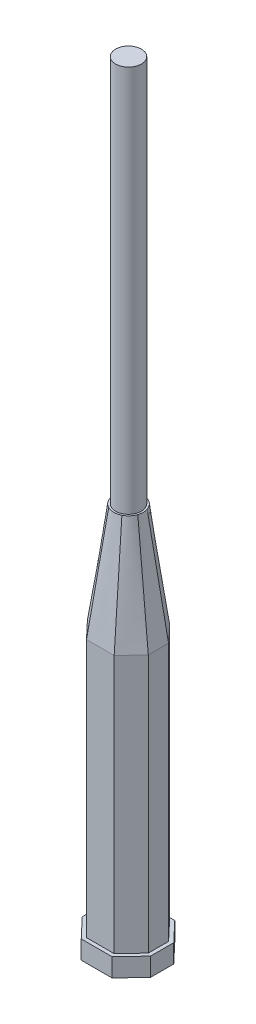
ISO-10303-21;
HEADER;
FILE_DESCRIPTION(('STEP AP214'),'2;1');
FILE_NAME('part.step','',(''),(''),'','','');
FILE_SCHEMA(('AUTOMOTIVE_DESIGN { 1 0 10303 214 1 1 1 1 }'));
ENDSEC;
DATA;
#1=APPLICATION_CONTEXT('core data for automotive mechanical design processes');
#2=APPLICATION_PROTOCOL_DEFINITION('international standard','automotive_design',2000,#1);
#3=PRODUCT_CONTEXT('',#1,'mechanical');
#4=PRODUCT('Part','Part','',(#3));
#5=PRODUCT_RELATED_PRODUCT_CATEGORY('part','',(#4));
#6=PRODUCT_DEFINITION_FORMATION('','',#4);
#7=PRODUCT_DEFINITION_CONTEXT('part definition',#1,'design');
#8=PRODUCT_DEFINITION('design','',#6,#7);
#9=PRODUCT_DEFINITION_SHAPE('','',#8);
#10=(LENGTH_UNIT() NAMED_UNIT(*) SI_UNIT(.MILLI.,.METRE.));
#11=(NAMED_UNIT(*) PLANE_ANGLE_UNIT() SI_UNIT($,.RADIAN.));
#12=(NAMED_UNIT(*) SI_UNIT($,.STERADIAN.) SOLID_ANGLE_UNIT());
#13=UNCERTAINTY_MEASURE_WITH_UNIT(LENGTH_MEASURE(1.E-05),#10,'distance_accuracy_value','');
#14=(GEOMETRIC_REPRESENTATION_CONTEXT(3) GLOBAL_UNCERTAINTY_ASSIGNED_CONTEXT((#13)) GLOBAL_UNIT_ASSIGNED_CONTEXT((#10,
#11,#12)) REPRESENTATION_CONTEXT('',''));
#15=CARTESIAN_POINT('',(0.,0.,0.));
#16=DIRECTION('',(0.,0.,1.));
#17=DIRECTION('',(1.,0.,0.));
#18=AXIS2_PLACEMENT_3D('',#15,#16,#17);
#19=CARTESIAN_POINT('',(-18.5,-10.,-6.29694496184497));
#20=DIRECTION('',(-1.,0.,0.));
#21=DIRECTION('',(0.,0.,1.));
#22=AXIS2_PLACEMENT_3D('',#19,#20,#21);
#23=PLANE('',#22);
#24=DIRECTION('',(0.,0.,1.));
#25=VECTOR('',#24,1.);
#26=CARTESIAN_POINT('',(-18.5,0.,-6.29694496184497));
#27=LINE('',#26,#25);
#28=CARTESIAN_POINT('',(-18.5,0.,-6.29694496184497));
#29=VERTEX_POINT('',#28);
#30=CARTESIAN_POINT('',(-18.5,0.,6.29694496184498));
#31=VERTEX_POINT('',#30);
#32=EDGE_CURVE('E497',#29,#31,#27,.T.);
#33=ORIENTED_EDGE('',*,*,#32,.F.);
#34=DIRECTION('',(0.,1.,0.));
#35=VECTOR('',#34,1.);
#36=CARTESIAN_POINT('',(-18.5,-10.,-6.29694496184497));
#37=LINE('',#36,#35);
#38=CARTESIAN_POINT('',(-18.5,-10.,-6.29694496184497));
#39=VERTEX_POINT('',#38);
#40=EDGE_CURVE('E100',#39,#29,#37,.T.);
#41=ORIENTED_EDGE('',*,*,#40,.F.);
#42=DIRECTION('',(0.,0.,1.));
#43=VECTOR('',#42,1.);
#44=CARTESIAN_POINT('',(-18.5,-10.,-6.29694496184497));
#45=LINE('',#44,#43);
#46=CARTESIAN_POINT('',(-18.5,-10.,6.29694496184498));
#47=VERTEX_POINT('',#46);
#48=EDGE_CURVE('E471',#39,#47,#45,.T.);
#49=ORIENTED_EDGE('',*,*,#48,.T.);
#50=DIRECTION('',(0.,1.,0.));
#51=VECTOR('',#50,1.);
#52=CARTESIAN_POINT('',(-18.5,-10.,6.29694496184498));
#53=LINE('',#52,#51);
#54=EDGE_CURVE('E496',#47,#31,#53,.T.);
#55=ORIENTED_EDGE('',*,*,#54,.T.);
#56=EDGE_LOOP('',(#33,#41,#49,#55));
#57=FACE_BOUND('',#56,.T.);
#58=ADVANCED_FACE('F92',(#57),#23,.T.);
#59=CARTESIAN_POINT('',(-8.36026364806365,-10.,-17.));
#60=DIRECTION('',(-0.725952683905827,0.,-0.687744647910783));
#61=DIRECTION('',(-0.687744647910783,0.,0.725952683905827));
#62=AXIS2_PLACEMENT_3D('',#59,#60,#61);
#63=PLANE('',#62);
#64=DIRECTION('',(-0.687744647910783,0.,0.725952683905827));
#65=VECTOR('',#64,1.);
#66=CARTESIAN_POINT('',(-8.36026364806365,0.,-17.));
#67=LINE('',#66,#65);
#68=CARTESIAN_POINT('',(-8.36026364806365,0.,-17.));
#69=VERTEX_POINT('',#68);
#70=EDGE_CURVE('E475',#69,#29,#67,.T.);
#71=ORIENTED_EDGE('',*,*,#70,.F.);
#72=DIRECTION('',(0.,1.,0.));
#73=VECTOR('',#72,1.);
#74=CARTESIAN_POINT('',(-8.36026364806365,-10.,-17.));
#75=LINE('',#74,#73);
#76=CARTESIAN_POINT('',(-8.36026364806365,-10.,-17.));
#77=VERTEX_POINT('',#76);
#78=EDGE_CURVE('E523',#77,#69,#75,.T.);
#79=ORIENTED_EDGE('',*,*,#78,.F.);
#80=DIRECTION('',(-0.687744647910783,0.,0.725952683905827));
#81=VECTOR('',#80,1.);
#82=CARTESIAN_POINT('',(-8.36026364806365,-10.,-17.));
#83=LINE('',#82,#81);
#84=EDGE_CURVE('E493',#77,#39,#83,.T.);
#85=ORIENTED_EDGE('',*,*,#84,.T.);
#86=ORIENTED_EDGE('',*,*,#40,.T.);
#87=EDGE_LOOP('',(#71,#79,#85,#86));
#88=FACE_BOUND('',#87,.T.);
#89=ADVANCED_FACE('F652',(#88),#63,.T.);
#90=CARTESIAN_POINT('',(8.36026364806367,-10.,-17.));
#91=DIRECTION('',(0.,0.,-1.));
#92=DIRECTION('',(-1.,0.,0.));
#93=AXIS2_PLACEMENT_3D('',#90,#91,#92);
#94=PLANE('',#93);
#95=DIRECTION('',(-1.,0.,0.));
#96=VECTOR('',#95,1.);
#97=CARTESIAN_POINT('',(8.36026364806367,0.,-17.));
#98=LINE('',#97,#96);
#99=CARTESIAN_POINT('',(8.36026364806367,0.,-17.));
#100=VERTEX_POINT('',#99);
#101=EDGE_CURVE('E516',#100,#69,#98,.T.);
#102=ORIENTED_EDGE('',*,*,#101,.F.);
#103=DIRECTION('',(0.,1.,0.));
#104=VECTOR('',#103,1.);
#105=CARTESIAN_POINT('',(8.36026364806367,-10.,-17.));
#106=LINE('',#105,#104);
#107=CARTESIAN_POINT('',(8.36026364806367,-10.,-17.));
#108=VERTEX_POINT('',#107);
#109=EDGE_CURVE('E526',#108,#100,#106,.T.);
#110=ORIENTED_EDGE('',*,*,#109,.F.);
#111=DIRECTION('',(-1.,0.,0.));
#112=VECTOR('',#111,1.);
#113=CARTESIAN_POINT('',(8.36026364806367,-10.,-17.));
#114=LINE('',#113,#112);
#115=EDGE_CURVE('E490',#108,#77,#114,.T.);
#116=ORIENTED_EDGE('',*,*,#115,.T.);
#117=ORIENTED_EDGE('',*,*,#78,.T.);
#118=EDGE_LOOP('',(#102,#110,#116,#117));
#119=FACE_BOUND('',#118,.T.);
#120=ADVANCED_FACE('F660',(#119),#94,.T.);
#121=CARTESIAN_POINT('',(18.5,-10.,-6.29694496184498));
#122=DIRECTION('',(0.725952683905827,0.,-0.687744647910782));
#123=DIRECTION('',(-0.687744647910783,0.,-0.725952683905827));
#124=AXIS2_PLACEMENT_3D('',#121,#122,#123);
#125=PLANE('',#124);
#126=DIRECTION('',(-0.687744647910782,0.,-0.725952683905827));
#127=VECTOR('',#126,1.);
#128=CARTESIAN_POINT('',(18.5,0.,-6.29694496184498));
#129=LINE('',#128,#127);
#130=CARTESIAN_POINT('',(18.5,0.,-6.29694496184498));
#131=VERTEX_POINT('',#130);
#132=EDGE_CURVE('E513',#131,#100,#129,.T.);
#133=ORIENTED_EDGE('',*,*,#132,.F.);
#134=DIRECTION('',(0.,1.,0.));
#135=VECTOR('',#134,1.);
#136=CARTESIAN_POINT('',(18.5,-10.,-6.29694496184498));
#137=LINE('',#136,#135);
#138=CARTESIAN_POINT('',(18.5,-10.,-6.29694496184498));
#139=VERTEX_POINT('',#138);
#140=EDGE_CURVE('E529',#139,#131,#137,.T.);
#141=ORIENTED_EDGE('',*,*,#140,.F.);
#142=DIRECTION('',(-0.687744647910782,0.,-0.725952683905827));
#143=VECTOR('',#142,1.);
#144=CARTESIAN_POINT('',(18.5,-10.,-6.29694496184498));
#145=LINE('',#144,#143);
#146=EDGE_CURVE('E487',#139,#108,#145,.T.);
#147=ORIENTED_EDGE('',*,*,#146,.T.);
#148=ORIENTED_EDGE('',*,*,#109,.T.);
#149=EDGE_LOOP('',(#133,#141,#147,#148));
#150=FACE_BOUND('',#149,.T.);
#151=ADVANCED_FACE('F667',(#150),#125,.T.);
#152=CARTESIAN_POINT('',(18.5,-10.,6.29694496184498));
#153=DIRECTION('',(1.,0.,0.));
#154=DIRECTION('',(0.,0.,-1.));
#155=AXIS2_PLACEMENT_3D('',#152,#153,#154);
#156=PLANE('',#155);
#157=DIRECTION('',(0.,0.,-1.));
#158=VECTOR('',#157,1.);
#159=CARTESIAN_POINT('',(18.5,0.,6.29694496184498));
#160=LINE('',#159,#158);
#161=CARTESIAN_POINT('',(18.5,0.,6.29694496184498));
#162=VERTEX_POINT('',#161);
#163=EDGE_CURVE('E510',#162,#131,#160,.T.);
#164=ORIENTED_EDGE('',*,*,#163,.F.);
#165=DIRECTION('',(0.,1.,0.));
#166=VECTOR('',#165,1.);
#167=CARTESIAN_POINT('',(18.5,-10.,6.29694496184498));
#168=LINE('',#167,#166);
#169=CARTESIAN_POINT('',(18.5,-10.,6.29694496184498));
#170=VERTEX_POINT('',#169);
#171=EDGE_CURVE('E532',#170,#162,#168,.T.);
#172=ORIENTED_EDGE('',*,*,#171,.F.);
#173=DIRECTION('',(0.,0.,-1.));
#174=VECTOR('',#173,1.);
#175=CARTESIAN_POINT('',(18.5,-10.,6.29694496184498));
#176=LINE('',#175,#174);
#177=EDGE_CURVE('E484',#170,#139,#176,.T.);
#178=ORIENTED_EDGE('',*,*,#177,.T.);
#179=ORIENTED_EDGE('',*,*,#140,.T.);
#180=EDGE_LOOP('',(#164,#172,#178,#179));
#181=FACE_BOUND('',#180,.T.);
#182=ADVANCED_FACE('F670',(#181),#156,.T.);
#183=CARTESIAN_POINT('',(8.36026364806367,-10.,17.));
#184=DIRECTION('',(0.725952683905827,0.,0.687744647910783));
#185=DIRECTION('',(0.687744647910783,0.,-0.725952683905827));
#186=AXIS2_PLACEMENT_3D('',#183,#184,#185);
#187=PLANE('',#186);
#188=DIRECTION('',(0.687744647910783,0.,-0.725952683905827));
#189=VECTOR('',#188,1.);
#190=CARTESIAN_POINT('',(8.36026364806367,0.,17.));
#191=LINE('',#190,#189);
#192=CARTESIAN_POINT('',(8.36026364806367,0.,17.));
#193=VERTEX_POINT('',#192);
#194=EDGE_CURVE('E507',#193,#162,#191,.T.);
#195=ORIENTED_EDGE('',*,*,#194,.F.);
#196=DIRECTION('',(0.,1.,0.));
#197=VECTOR('',#196,1.);
#198=CARTESIAN_POINT('',(8.36026364806367,-10.,17.));
#199=LINE('',#198,#197);
#200=CARTESIAN_POINT('',(8.36026364806367,-10.,17.));
#201=VERTEX_POINT('',#200);
#202=EDGE_CURVE('E535',#201,#193,#199,.T.);
#203=ORIENTED_EDGE('',*,*,#202,.F.);
#204=DIRECTION('',(0.687744647910783,0.,-0.725952683905827));
#205=VECTOR('',#204,1.);
#206=CARTESIAN_POINT('',(8.36026364806367,-10.,17.));
#207=LINE('',#206,#205);
#208=EDGE_CURVE('E481',#201,#170,#207,.T.);
#209=ORIENTED_EDGE('',*,*,#208,.T.);
#210=ORIENTED_EDGE('',*,*,#171,.T.);
#211=EDGE_LOOP('',(#195,#203,#209,#210));
#212=FACE_BOUND('',#211,.T.);
#213=ADVANCED_FACE('F675',(#212),#187,.T.);
#214=CARTESIAN_POINT('',(-8.36026364806369,-10.,17.));
#215=DIRECTION('',(0.,0.,1.));
#216=DIRECTION('',(1.,0.,0.));
#217=AXIS2_PLACEMENT_3D('',#214,#215,#216);
#218=PLANE('',#217);
#219=DIRECTION('',(1.,0.,0.));
#220=VECTOR('',#219,1.);
#221=CARTESIAN_POINT('',(-8.36026364806369,0.,17.));
#222=LINE('',#221,#220);
#223=CARTESIAN_POINT('',(-8.36026364806369,0.,17.));
#224=VERTEX_POINT('',#223);
#225=EDGE_CURVE('E504',#224,#193,#222,.T.);
#226=ORIENTED_EDGE('',*,*,#225,.F.);
#227=DIRECTION('',(0.,1.,0.));
#228=VECTOR('',#227,1.);
#229=CARTESIAN_POINT('',(-8.36026364806369,-10.,17.));
#230=LINE('',#229,#228);
#231=CARTESIAN_POINT('',(-8.36026364806369,-10.,17.));
#232=VERTEX_POINT('',#231);
#233=EDGE_CURVE('E538',#232,#224,#230,.T.);
#234=ORIENTED_EDGE('',*,*,#233,.F.);
#235=DIRECTION('',(1.,0.,0.));
#236=VECTOR('',#235,1.);
#237=CARTESIAN_POINT('',(-8.36026364806369,-10.,17.));
#238=LINE('',#237,#236);
#239=EDGE_CURVE('E478',#232,#201,#238,.T.);
#240=ORIENTED_EDGE('',*,*,#239,.T.);
#241=ORIENTED_EDGE('',*,*,#202,.T.);
#242=EDGE_LOOP('',(#226,#234,#240,#241));
#243=FACE_BOUND('',#242,.T.);
#244=ADVANCED_FACE('F678',(#243),#218,.T.);
#245=CARTESIAN_POINT('',(-18.5,-10.,6.29694496184498));
#246=DIRECTION('',(-0.725952683905827,0.,0.687744647910783));
#247=DIRECTION('',(0.687744647910783,0.,0.725952683905827));
#248=AXIS2_PLACEMENT_3D('',#245,#246,#247);
#249=PLANE('',#248);
#250=DIRECTION('',(0.687744647910783,0.,0.725952683905827));
#251=VECTOR('',#250,1.);
#252=CARTESIAN_POINT('',(-18.5,0.,6.29694496184498));
#253=LINE('',#252,#251);
#254=EDGE_CURVE('E500',#31,#224,#253,.T.);
#255=ORIENTED_EDGE('',*,*,#254,.F.);
#256=ORIENTED_EDGE('',*,*,#54,.F.);
#257=DIRECTION('',(0.687744647910783,0.,0.725952683905827));
#258=VECTOR('',#257,1.);
#259=CARTESIAN_POINT('',(-18.5,-10.,6.29694496184498));
#260=LINE('',#259,#258);
#261=EDGE_CURVE('E474',#47,#232,#260,.T.);
#262=ORIENTED_EDGE('',*,*,#261,.T.);
#263=ORIENTED_EDGE('',*,*,#233,.T.);
#264=EDGE_LOOP('',(#255,#256,#262,#263));
#265=FACE_BOUND('',#264,.T.);
#266=ADVANCED_FACE('F681',(#265),#249,.T.);
#267=CARTESIAN_POINT('',(0.,-10.,0.));
#268=DIRECTION('',(0.,1.,0.));
#269=DIRECTION('',(0.,0.,1.));
#270=AXIS2_PLACEMENT_3D('',#267,#268,#269);
#271=PLANE('',#270);
#272=ORIENTED_EDGE('',*,*,#48,.F.);
#273=ORIENTED_EDGE('',*,*,#84,.F.);
#274=ORIENTED_EDGE('',*,*,#115,.F.);
#275=ORIENTED_EDGE('',*,*,#146,.F.);
#276=ORIENTED_EDGE('',*,*,#177,.F.);
#277=ORIENTED_EDGE('',*,*,#208,.F.);
#278=ORIENTED_EDGE('',*,*,#239,.F.);
#279=ORIENTED_EDGE('',*,*,#261,.F.);
#280=EDGE_LOOP('',(#272,#273,#274,#275,#276,#277,#278,#279));
#281=FACE_BOUND('',#280,.T.);
#282=ADVANCED_FACE('F665',(#281),#271,.F.);
#283=CARTESIAN_POINT('',(0.,0.,0.));
#284=DIRECTION('',(0.,1.,0.));
#285=DIRECTION('',(0.,0.,1.));
#286=AXIS2_PLACEMENT_3D('',#283,#284,#285);
#287=PLANE('',#286);
#288=DIRECTION('',(0.,0.,1.));
#289=VECTOR('',#288,1.);
#290=CARTESIAN_POINT('',(16.5,0.,0.));
#291=LINE('',#290,#289);
#292=CARTESIAN_POINT('',(16.5,0.,-5.5));
#293=VERTEX_POINT('',#292);
#294=CARTESIAN_POINT('',(16.5,0.,5.5));
#295=VERTEX_POINT('',#294);
#296=EDGE_CURVE('E446',#293,#295,#291,.T.);
#297=ORIENTED_EDGE('',*,*,#296,.T.);
#298=DIRECTION('',(0.687744647910783,0.,-0.725952683905827));
#299=VECTOR('',#298,1.);
#300=CARTESIAN_POINT('',(11.4416058394161,0.,10.8394160583942));
#301=LINE('',#300,#299);
#302=CARTESIAN_POINT('',(7.50000000000001,0.,15.));
#303=VERTEX_POINT('',#302);
#304=EDGE_CURVE('E467',#303,#295,#301,.T.);
#305=ORIENTED_EDGE('',*,*,#304,.F.);
#306=DIRECTION('',(-1.,0.,0.));
#307=VECTOR('',#306,1.);
#308=CARTESIAN_POINT('',(0.,0.,15.));
#309=LINE('',#308,#307);
#310=CARTESIAN_POINT('',(-7.50000000000002,0.,15.));
#311=VERTEX_POINT('',#310);
#312=EDGE_CURVE('E108',#303,#311,#309,.T.);
#313=ORIENTED_EDGE('',*,*,#312,.T.);
#314=DIRECTION('',(0.687744647910783,0.,0.725952683905827));
#315=VECTOR('',#314,1.);
#316=CARTESIAN_POINT('',(-11.4416058394161,0.,10.8394160583942));
#317=LINE('',#316,#315);
#318=CARTESIAN_POINT('',(-16.5,0.,5.5));
#319=VERTEX_POINT('',#318);
#320=EDGE_CURVE('E463',#319,#311,#317,.T.);
#321=ORIENTED_EDGE('',*,*,#320,.F.);
#322=DIRECTION('',(0.,0.,-1.));
#323=VECTOR('',#322,1.);
#324=CARTESIAN_POINT('',(-16.5,0.,0.));
#325=LINE('',#324,#323);
#326=CARTESIAN_POINT('',(-16.5,0.,-5.5));
#327=VERTEX_POINT('',#326);
#328=EDGE_CURVE('E460',#319,#327,#325,.T.);
#329=ORIENTED_EDGE('',*,*,#328,.T.);
#330=DIRECTION('',(-0.687744647910783,0.,0.725952683905827));
#331=VECTOR('',#330,1.);
#332=CARTESIAN_POINT('',(-11.4416058394161,0.,-10.8394160583942));
#333=LINE('',#332,#331);
#334=CARTESIAN_POINT('',(-7.5,0.,-15.));
#335=VERTEX_POINT('',#334);
#336=EDGE_CURVE('E458',#335,#327,#333,.T.);
#337=ORIENTED_EDGE('',*,*,#336,.F.);
#338=DIRECTION('',(1.,0.,0.));
#339=VECTOR('',#338,1.);
#340=CARTESIAN_POINT('',(0.,0.,-15.));
#341=LINE('',#340,#339);
#342=CARTESIAN_POINT('',(7.50000000000001,0.,-15.));
#343=VERTEX_POINT('',#342);
#344=EDGE_CURVE('E150',#335,#343,#341,.T.);
#345=ORIENTED_EDGE('',*,*,#344,.T.);
#346=DIRECTION('',(-0.687744647910783,0.,-0.725952683905827));
#347=VECTOR('',#346,1.);
#348=CARTESIAN_POINT('',(11.4416058394161,0.,-10.8394160583942));
#349=LINE('',#348,#347);
#350=EDGE_CURVE('E454',#293,#343,#349,.T.);
#351=ORIENTED_EDGE('',*,*,#350,.F.);
#352=EDGE_LOOP('',(#297,#305,#313,#321,#329,#337,#345,#351));
#353=FACE_BOUND('',#352,.T.);
#354=ORIENTED_EDGE('',*,*,#32,.T.);
#355=ORIENTED_EDGE('',*,*,#254,.T.);
#356=ORIENTED_EDGE('',*,*,#225,.T.);
#357=ORIENTED_EDGE('',*,*,#194,.T.);
#358=ORIENTED_EDGE('',*,*,#163,.T.);
#359=ORIENTED_EDGE('',*,*,#132,.T.);
#360=ORIENTED_EDGE('',*,*,#101,.T.);
#361=ORIENTED_EDGE('',*,*,#70,.T.);
#362=EDGE_LOOP('',(#354,#355,#356,#357,#358,#359,#360,#361));
#363=FACE_BOUND('',#362,.T.);
#364=ADVANCED_FACE('F658',(#353,#363),#287,.T.);
#365=CARTESIAN_POINT('',(16.5,140.,0.));
#366=DIRECTION('',(1.,0.,0.));
#367=DIRECTION('',(0.,0.,-1.));
#368=AXIS2_PLACEMENT_3D('',#365,#366,#367);
#369=PLANE('',#368);
#370=ORIENTED_EDGE('',*,*,#296,.F.);
#371=DIRECTION('',(0.,-1.,0.));
#372=VECTOR('',#371,1.);
#373=CARTESIAN_POINT('',(16.5,140.,-5.5));
#374=LINE('',#373,#372);
#375=CARTESIAN_POINT('',(16.5,140.,-5.49999999999999));
#376=VERTEX_POINT('',#375);
#377=EDGE_CURVE('E501',#376,#293,#374,.T.);
#378=ORIENTED_EDGE('',*,*,#377,.F.);
#379=DIRECTION('',(0.,0.,-1.));
#380=VECTOR('',#379,1.);
#381=CARTESIAN_POINT('',(16.5,140.,0.));
#382=LINE('',#381,#380);
#383=CARTESIAN_POINT('',(16.5,140.,5.5));
#384=VERTEX_POINT('',#383);
#385=EDGE_CURVE('E470',#376,#384,#382,.F.);
#386=ORIENTED_EDGE('',*,*,#385,.T.);
#387=DIRECTION('',(0.,-1.,0.));
#388=VECTOR('',#387,1.);
#389=CARTESIAN_POINT('',(16.5,140.,5.5));
#390=LINE('',#389,#388);
#391=EDGE_CURVE('E548',#384,#295,#390,.T.);
#392=ORIENTED_EDGE('',*,*,#391,.T.);
#393=EDGE_LOOP('',(#370,#378,#386,#392));
#394=FACE_BOUND('',#393,.T.);
#395=ADVANCED_FACE('F579',(#394),#369,.T.);
#396=CARTESIAN_POINT('',(11.4416058394161,140.,-10.8394160583942));
#397=DIRECTION('',(-0.725952683905827,0.,0.687744647910783));
#398=DIRECTION('',(0.687744647910783,0.,0.725952683905827));
#399=AXIS2_PLACEMENT_3D('',#396,#397,#398);
#400=PLANE('',#399);
#401=ORIENTED_EDGE('',*,*,#350,.T.);
#402=DIRECTION('',(0.,-1.,0.));
#403=VECTOR('',#402,1.);
#404=CARTESIAN_POINT('',(7.50000000000001,140.,-15.));
#405=LINE('',#404,#403);
#406=CARTESIAN_POINT('',(7.50000000000001,140.,-15.));
#407=VERTEX_POINT('',#406);
#408=EDGE_CURVE('E154',#407,#343,#405,.T.);
#409=ORIENTED_EDGE('',*,*,#408,.F.);
#410=DIRECTION('',(0.687744647910783,0.,0.725952683905827));
#411=VECTOR('',#410,1.);
#412=CARTESIAN_POINT('',(11.4416058394161,140.,-10.8394160583942));
#413=LINE('',#412,#411);
#414=EDGE_CURVE('E176',#376,#407,#413,.F.);
#415=ORIENTED_EDGE('',*,*,#414,.F.);
#416=ORIENTED_EDGE('',*,*,#377,.T.);
#417=EDGE_LOOP('',(#401,#409,#415,#416));
#418=FACE_BOUND('',#417,.T.);
#419=ADVANCED_FACE('F574',(#418),#400,.F.);
#420=CARTESIAN_POINT('',(0.,140.,-15.));
#421=DIRECTION('',(0.,0.,-1.));
#422=DIRECTION('',(-1.,0.,0.));
#423=AXIS2_PLACEMENT_3D('',#420,#421,#422);
#424=PLANE('',#423);
#425=ORIENTED_EDGE('',*,*,#344,.F.);
#426=DIRECTION('',(0.,-1.,0.));
#427=VECTOR('',#426,1.);
#428=CARTESIAN_POINT('',(-7.5,140.,-15.));
#429=LINE('',#428,#427);
#430=CARTESIAN_POINT('',(-7.49999999999999,140.,-15.));
#431=VERTEX_POINT('',#430);
#432=EDGE_CURVE('E141',#431,#335,#429,.T.);
#433=ORIENTED_EDGE('',*,*,#432,.F.);
#434=DIRECTION('',(-1.,0.,0.));
#435=VECTOR('',#434,1.);
#436=CARTESIAN_POINT('',(0.,140.,-15.));
#437=LINE('',#436,#435);
#438=EDGE_CURVE('E146',#431,#407,#437,.F.);
#439=ORIENTED_EDGE('',*,*,#438,.T.);
#440=ORIENTED_EDGE('',*,*,#408,.T.);
#441=EDGE_LOOP('',(#425,#433,#439,#440));
#442=FACE_BOUND('',#441,.T.);
#443=ADVANCED_FACE('F143',(#442),#424,.T.);
#444=CARTESIAN_POINT('',(-11.4416058394161,140.,-10.8394160583942));
#445=DIRECTION('',(0.725952683905827,0.,0.687744647910783));
#446=DIRECTION('',(0.687744647910783,0.,-0.725952683905827));
#447=AXIS2_PLACEMENT_3D('',#444,#445,#446);
#448=PLANE('',#447);
#449=ORIENTED_EDGE('',*,*,#336,.T.);
#450=DIRECTION('',(0.,-1.,0.));
#451=VECTOR('',#450,1.);
#452=CARTESIAN_POINT('',(-16.5,140.,-5.5));
#453=LINE('',#452,#451);
#454=CARTESIAN_POINT('',(-16.5,140.,-5.5));
#455=VERTEX_POINT('',#454);
#456=EDGE_CURVE('E155',#455,#327,#453,.T.);
#457=ORIENTED_EDGE('',*,*,#456,.F.);
#458=DIRECTION('',(0.687744647910783,0.,-0.725952683905827));
#459=VECTOR('',#458,1.);
#460=CARTESIAN_POINT('',(-11.4416058394161,140.,-10.8394160583942));
#461=LINE('',#460,#459);
#462=EDGE_CURVE('E159',#431,#455,#461,.F.);
#463=ORIENTED_EDGE('',*,*,#462,.F.);
#464=ORIENTED_EDGE('',*,*,#432,.T.);
#465=EDGE_LOOP('',(#449,#457,#463,#464));
#466=FACE_BOUND('',#465,.T.);
#467=ADVANCED_FACE('F160',(#466),#448,.F.);
#468=CARTESIAN_POINT('',(-16.5,140.,0.));
#469=DIRECTION('',(-1.,0.,0.));
#470=DIRECTION('',(0.,0.,1.));
#471=AXIS2_PLACEMENT_3D('',#468,#469,#470);
#472=PLANE('',#471);
#473=ORIENTED_EDGE('',*,*,#328,.F.);
#474=DIRECTION('',(0.,-1.,0.));
#475=VECTOR('',#474,1.);
#476=CARTESIAN_POINT('',(-16.5,140.,5.5));
#477=LINE('',#476,#475);
#478=CARTESIAN_POINT('',(-16.5,140.,5.5));
#479=VERTEX_POINT('',#478);
#480=EDGE_CURVE('E543',#479,#319,#477,.T.);
#481=ORIENTED_EDGE('',*,*,#480,.F.);
#482=DIRECTION('',(0.,0.,1.));
#483=VECTOR('',#482,1.);
#484=CARTESIAN_POINT('',(-16.5,140.,0.));
#485=LINE('',#484,#483);
#486=EDGE_CURVE('E166',#479,#455,#485,.F.);
#487=ORIENTED_EDGE('',*,*,#486,.T.);
#488=ORIENTED_EDGE('',*,*,#456,.T.);
#489=EDGE_LOOP('',(#473,#481,#487,#488));
#490=FACE_BOUND('',#489,.T.);
#491=ADVANCED_FACE('F596',(#490),#472,.T.);
#492=CARTESIAN_POINT('',(-11.4416058394161,140.,10.8394160583942));
#493=DIRECTION('',(0.725952683905827,0.,-0.687744647910783));
#494=DIRECTION('',(-0.687744647910783,0.,-0.725952683905827));
#495=AXIS2_PLACEMENT_3D('',#492,#493,#494);
#496=PLANE('',#495);
#497=ORIENTED_EDGE('',*,*,#320,.T.);
#498=DIRECTION('',(0.,-1.,0.));
#499=VECTOR('',#498,1.);
#500=CARTESIAN_POINT('',(-7.50000000000002,140.,15.));
#501=LINE('',#500,#499);
#502=CARTESIAN_POINT('',(-7.50000000000002,140.,15.));
#503=VERTEX_POINT('',#502);
#504=EDGE_CURVE('E554',#503,#311,#501,.T.);
#505=ORIENTED_EDGE('',*,*,#504,.F.);
#506=DIRECTION('',(-0.687744647910783,0.,-0.725952683905827));
#507=VECTOR('',#506,1.);
#508=CARTESIAN_POINT('',(-11.4416058394161,140.,10.8394160583942));
#509=LINE('',#508,#507);
#510=EDGE_CURVE('E560',#479,#503,#509,.F.);
#511=ORIENTED_EDGE('',*,*,#510,.F.);
#512=ORIENTED_EDGE('',*,*,#480,.T.);
#513=EDGE_LOOP('',(#497,#505,#511,#512));
#514=FACE_BOUND('',#513,.T.);
#515=ADVANCED_FACE('F592',(#514),#496,.F.);
#516=CARTESIAN_POINT('',(0.,140.,15.));
#517=DIRECTION('',(0.,0.,1.));
#518=DIRECTION('',(1.,0.,0.));
#519=AXIS2_PLACEMENT_3D('',#516,#517,#518);
#520=PLANE('',#519);
#521=ORIENTED_EDGE('',*,*,#312,.F.);
#522=DIRECTION('',(0.,-1.,0.));
#523=VECTOR('',#522,1.);
#524=CARTESIAN_POINT('',(7.50000000000001,140.,15.));
#525=LINE('',#524,#523);
#526=CARTESIAN_POINT('',(7.50000000000001,140.,15.));
#527=VERTEX_POINT('',#526);
#528=EDGE_CURVE('E551',#527,#303,#525,.T.);
#529=ORIENTED_EDGE('',*,*,#528,.F.);
#530=DIRECTION('',(1.,0.,0.));
#531=VECTOR('',#530,1.);
#532=CARTESIAN_POINT('',(0.,140.,15.));
#533=LINE('',#532,#531);
#534=EDGE_CURVE('E563',#527,#503,#533,.F.);
#535=ORIENTED_EDGE('',*,*,#534,.T.);
#536=ORIENTED_EDGE('',*,*,#504,.T.);
#537=EDGE_LOOP('',(#521,#529,#535,#536));
#538=FACE_BOUND('',#537,.T.);
#539=ADVANCED_FACE('F586',(#538),#520,.T.);
#540=CARTESIAN_POINT('',(11.4416058394161,140.,10.8394160583942));
#541=DIRECTION('',(-0.725952683905827,0.,-0.687744647910783));
#542=DIRECTION('',(-0.687744647910783,0.,0.725952683905827));
#543=AXIS2_PLACEMENT_3D('',#540,#541,#542);
#544=PLANE('',#543);
#545=ORIENTED_EDGE('',*,*,#304,.T.);
#546=ORIENTED_EDGE('',*,*,#391,.F.);
#547=DIRECTION('',(-0.687744647910783,0.,0.725952683905827));
#548=VECTOR('',#547,1.);
#549=CARTESIAN_POINT('',(11.4416058394161,140.,10.8394160583942));
#550=LINE('',#549,#548);
#551=EDGE_CURVE('E552',#527,#384,#550,.F.);
#552=ORIENTED_EDGE('',*,*,#551,.F.);
#553=ORIENTED_EDGE('',*,*,#528,.T.);
#554=EDGE_LOOP('',(#545,#546,#552,#553));
#555=FACE_BOUND('',#554,.T.);
#556=ADVANCED_FACE('F319',(#555),#544,.F.);
#557=CARTESIAN_POINT('',(0.160345540976436,200.,-0.107525364327898));
#558=DIRECTION('',(0.,1.,0.));
#559=DIRECTION('',(0.,0.,1.));
#560=AXIS2_PLACEMENT_3D('',#557,#558,#559);
#561=PLANE('',#560);
#562=CARTESIAN_POINT('',(0.160345540976436,200.,-0.107525364327898));
#563=DIRECTION('',(0.,1.,0.));
#564=DIRECTION('',(0.,0.,1.));
#565=AXIS2_PLACEMENT_3D('',#562,#563,#564);
#566=CIRCLE('',#565,7.);
#567=CARTESIAN_POINT('',(0.160345540976436,200.,6.8924746356721));
#568=VERTEX_POINT('',#567);
#569=EDGE_CURVE('E13',#568,#568,#566,.T.);
#570=ORIENTED_EDGE('',*,*,#569,.F.);
#571=EDGE_LOOP('',(#570));
#572=FACE_BOUND('',#571,.T.);
#573=CARTESIAN_POINT('',(0.160345540976436,200.,-0.107525364327898));
#574=DIRECTION('',(0.,1.,0.));
#575=DIRECTION('',(0.,0.,1.));
#576=AXIS2_PLACEMENT_3D('',#573,#574,#575);
#577=CIRCLE('',#576,8.);
#578=CARTESIAN_POINT('',(-7.42912084342767,200.,2.4222967638068));
#579=VERTEX_POINT('',#578);
#580=CARTESIAN_POINT('',(-3.41736322302324,200.,7.04789216367142));
#581=VERTEX_POINT('',#580);
#582=EDGE_CURVE('E406',#579,#581,#577,.T.);
#583=ORIENTED_EDGE('',*,*,#582,.T.);
#584=CARTESIAN_POINT('',(3.73805430497611,200.,7.04789216367143));
#585=VERTEX_POINT('',#584);
#586=EDGE_CURVE('E356',#581,#585,#577,.T.);
#587=ORIENTED_EDGE('',*,*,#586,.T.);
#588=CARTESIAN_POINT('',(7.74981192538055,200.,2.42229676380681));
#589=VERTEX_POINT('',#588);
#590=EDGE_CURVE('E414',#585,#589,#577,.T.);
#591=ORIENTED_EDGE('',*,*,#590,.T.);
#592=CARTESIAN_POINT('',(7.74981192538055,200.,-2.6373474924626));
#593=VERTEX_POINT('',#592);
#594=EDGE_CURVE('E340',#589,#593,#577,.T.);
#595=ORIENTED_EDGE('',*,*,#594,.T.);
#596=CARTESIAN_POINT('',(3.7380543049761,200.,-7.26294289232723));
#597=VERTEX_POINT('',#596);
#598=EDGE_CURVE('E282',#593,#597,#577,.T.);
#599=ORIENTED_EDGE('',*,*,#598,.T.);
#600=CARTESIAN_POINT('',(-3.41736322302322,200.,-7.26294289232723));
#601=VERTEX_POINT('',#600);
#602=EDGE_CURVE('E425',#597,#601,#577,.T.);
#603=ORIENTED_EDGE('',*,*,#602,.T.);
#604=CARTESIAN_POINT('',(-7.42912084342767,200.,-2.6373474924626));
#605=VERTEX_POINT('',#604);
#606=EDGE_CURVE('E181',#601,#605,#577,.T.);
#607=ORIENTED_EDGE('',*,*,#606,.T.);
#608=EDGE_CURVE('E202',#605,#579,#577,.T.);
#609=ORIENTED_EDGE('',*,*,#608,.T.);
#610=EDGE_LOOP('',(#583,#587,#591,#595,#599,#603,#607,#609));
#611=FACE_BOUND('',#610,.T.);
#612=ADVANCED_FACE('F233',(#572,#611),#561,.T.);
#613=CARTESIAN_POINT('',(-16.5,140.,-5.5));
#614=CARTESIAN_POINT('',(-7.42912084342767,200.,-2.6373474924626));
#615=CARTESIAN_POINT('',(-16.5,140.,-3.66666666666667));
#616=CARTESIAN_POINT('',(-7.69578751009434,200.,-1.8373474924626));
#617=CARTESIAN_POINT('',(-16.5,140.,-1.83333333333334));
#618=CARTESIAN_POINT('',(-7.83965445902357,200.,-0.973006218559256));
#619=CARTESIAN_POINT('',(-16.5,140.,1.83333333333333));
#620=CARTESIAN_POINT('',(-7.83965445902356,200.,0.757955489903457));
#621=CARTESIAN_POINT('',(-16.5,140.,3.66666666666667));
#622=CARTESIAN_POINT('',(-7.69578751009434,200.,1.6222967638068));
#623=CARTESIAN_POINT('',(-16.5,140.,5.5));
#624=CARTESIAN_POINT('',(-7.42912084342767,200.,2.4222967638068));
#625=B_SPLINE_SURFACE_WITH_KNOTS('',3,1,((#613,#614),(#615,#616),(#617,#618),(#619,#620),(#621,
#622),(#623,#624)),.UNSPECIFIED.,.F.,.F.,.F.,(4,2,4),(2,2),(0.,0.5,1.),(0.,1.),.UNSPECIFIED.);
#626=DIRECTION('',(0.149290803955677,0.987495046811477,-0.0506536116882739));
#627=VECTOR('',#626,1.);
#628=CARTESIAN_POINT('',(-11.9645604217138,170.,3.9611483819034));
#629=LINE('',#628,#627);
#630=EDGE_CURVE('E196',#479,#579,#629,.T.);
#631=DIRECTION('',(-0.149316640624201,-0.987665945363277,-0.0471224065850579));
#632=VECTOR('',#631,1.);
#633=CARTESIAN_POINT('',(-11.9645604217138,170.,-4.0686737462313));
#634=LINE('',#633,#632);
#635=EDGE_CURVE('E194',#605,#455,#634,.T.);
#636=ORIENTED_EDGE('',*,*,#486,.F.);
#637=ORIENTED_EDGE('',*,*,#630,.T.);
#638=ORIENTED_EDGE('',*,*,#608,.F.);
#639=ORIENTED_EDGE('',*,*,#635,.T.);
#640=EDGE_LOOP('',(#636,#637,#638,#639));
#641=FACE_BOUND('',#640,.T.);
#642=ADVANCED_FACE('F220',(#641),#625,.T.);
#643=CARTESIAN_POINT('',(-16.5,140.,5.5));
#644=CARTESIAN_POINT('',(-7.42912084342767,200.,2.4222967638068));
#645=CARTESIAN_POINT('',(-15.75,140.,6.29166666666667));
#646=CARTESIAN_POINT('',(-7.26776734088305,200.,2.90635727144068));
#647=CARTESIAN_POINT('',(-15.,140.,7.08333333333333));
#648=CARTESIAN_POINT('',(-7.0565465734044,200.,3.38422816645502));
#649=CARTESIAN_POINT('',(-13.5,140.,8.66666666666666));
#650=CARTESIAN_POINT('',(-6.53806408007696,200.,4.29783308407632));
#651=CARTESIAN_POINT('',(-12.75,140.,9.45833333333333));
#652=CARTESIAN_POINT('',(-6.2308267109498,200.,4.7333708741944));
#653=CARTESIAN_POINT('',(-11.25,140.,11.0416666666667));
#654=CARTESIAN_POINT('',(-5.53574548702864,200.,5.53480625891185));
#655=CARTESIAN_POINT('',(-10.5,140.,11.8333333333333));
#656=CARTESIAN_POINT('',(-5.14803499765969,200.,5.90055008188418));
#657=CARTESIAN_POINT('',(-9.00000000000002,140.,13.4166666666667));
#658=CARTESIAN_POINT('',(-4.3169367694458,200.,6.54302481014093));
#659=CARTESIAN_POINT('',(-8.25000000000002,140.,14.2083333333333));
#660=CARTESIAN_POINT('',(-3.87373984629325,200.,6.81970385203642));
#661=CARTESIAN_POINT('',(-7.50000000000002,140.,15.));
#662=CARTESIAN_POINT('',(-3.41736322302324,200.,7.04789216367142));
#663=B_SPLINE_SURFACE_WITH_KNOTS('',3,1,((#643,#644),(#645,#646),(#647,#648),(#649,#650),(#651,
#652),(#653,#654),(#655,#656),(#657,#658),(#659,#660),(#661,#662)),.UNSPECIFIED.,.F.,.F.,.F.,(4,
2,2,2,4),(2,2),(0.,0.25,0.5,0.75,1.),(0.,1.),.UNSPECIFIED.);
#664=DIRECTION('',(0.0673011526440126,0.989083619050472,-0.131088326630591));
#665=VECTOR('',#664,1.);
#666=CARTESIAN_POINT('',(-5.45868161151163,170.,11.0239460818357));
#667=LINE('',#666,#665);
#668=EDGE_CURVE('E197',#503,#581,#667,.T.);
#669=ORIENTED_EDGE('',*,*,#510,.T.);
#670=ORIENTED_EDGE('',*,*,#668,.T.);
#671=ORIENTED_EDGE('',*,*,#582,.F.);
#672=ORIENTED_EDGE('',*,*,#630,.F.);
#673=EDGE_LOOP('',(#669,#670,#671,#672));
#674=FACE_BOUND('',#673,.T.);
#675=ADVANCED_FACE('F232',(#674),#663,.T.);
#676=CARTESIAN_POINT('',(-7.5,140.,-15.));
#677=CARTESIAN_POINT('',(-3.41736322302322,200.,-7.26294289232723));
#678=CARTESIAN_POINT('',(-8.25000000000001,140.,-14.2083333333333));
#679=CARTESIAN_POINT('',(-3.87373984629324,200.,-7.03475458069222));
#680=CARTESIAN_POINT('',(-9.00000000000001,140.,-13.4166666666667));
#681=CARTESIAN_POINT('',(-4.31693676944579,200.,-6.75807553879674));
#682=CARTESIAN_POINT('',(-10.5,140.,-11.8333333333333));
#683=CARTESIAN_POINT('',(-5.14803499765968,200.,-6.11560081053998));
#684=CARTESIAN_POINT('',(-11.25,140.,-11.0416666666666));
#685=CARTESIAN_POINT('',(-5.53574548702863,200.,-5.74985698756766));
#686=CARTESIAN_POINT('',(-12.75,140.,-9.45833333333331));
#687=CARTESIAN_POINT('',(-6.23082671094979,200.,-4.94842160285021));
#688=CARTESIAN_POINT('',(-13.5,140.,-8.66666666666664));
#689=CARTESIAN_POINT('',(-6.53806408007696,200.,-4.51288381273213));
#690=CARTESIAN_POINT('',(-15.,140.,-7.08333333333332));
#691=CARTESIAN_POINT('',(-7.0565465734044,200.,-3.59927889511082));
#692=CARTESIAN_POINT('',(-15.75,140.,-6.29166666666666));
#693=CARTESIAN_POINT('',(-7.26776734088305,200.,-3.12140800009648));
#694=CARTESIAN_POINT('',(-16.5,140.,-5.5));
#695=CARTESIAN_POINT('',(-7.42912084342767,200.,-2.6373474924626));
#696=B_SPLINE_SURFACE_WITH_KNOTS('',3,1,((#676,#677),(#678,#679),(#680,#681),(#682,#683),(#684,
#685),(#686,#687),(#688,#689),(#690,#691),(#692,#693),(#694,#695)),.UNSPECIFIED.,.F.,.F.,.F.,(4,
2,2,2,4),(2,2),(0.,0.25,0.5,0.75,1.),(0.,1.),.UNSPECIFIED.);
#697=DIRECTION('',(0.0673320268315968,0.989537357983486,0.127601784148231));
#698=VECTOR('',#697,1.);
#699=CARTESIAN_POINT('',(-5.45868161151161,170.,-11.1314714461636));
#700=LINE('',#699,#698);
#701=EDGE_CURVE('E173',#431,#601,#700,.T.);
#702=ORIENTED_EDGE('',*,*,#462,.T.);
#703=ORIENTED_EDGE('',*,*,#635,.F.);
#704=ORIENTED_EDGE('',*,*,#606,.F.);
#705=ORIENTED_EDGE('',*,*,#701,.F.);
#706=EDGE_LOOP('',(#702,#703,#704,#705));
#707=FACE_BOUND('',#706,.T.);
#708=ADVANCED_FACE('F179',(#707),#696,.T.);
#709=CARTESIAN_POINT('',(-7.50000000000002,140.,15.));
#710=CARTESIAN_POINT('',(-3.41736322302324,200.,7.04789216367142));
#711=CARTESIAN_POINT('',(-6.25000000000002,140.,15.));
#712=CARTESIAN_POINT('',(-2.8840298896899,200.,7.31455883033809));
#713=CARTESIAN_POINT('',(-5.00000000000002,140.,15.));
#714=CARTESIAN_POINT('',(-2.306051188857,200.,7.52807285413206));
#715=CARTESIAN_POINT('',(-2.50000000000001,140.,15.));
#716=CARTESIAN_POINT('',(-1.09844596289725,200.,7.81717759114352));
#717=CARTESIAN_POINT('',(-1.25000000000001,140.,15.));
#718=CARTESIAN_POINT('',(-0.469169065689672,200.,7.8924746356721));
#719=CARTESIAN_POINT('',(1.24999999999999,140.,15.));
#720=CARTESIAN_POINT('',(0.789860147642543,200.,7.8924746356721));
#721=CARTESIAN_POINT('',(2.5,140.,15.));
#722=CARTESIAN_POINT('',(1.41913704485012,200.,7.81717759114352));
#723=CARTESIAN_POINT('',(5.,140.,15.));
#724=CARTESIAN_POINT('',(2.62674227080987,200.,7.52807285413206));
#725=CARTESIAN_POINT('',(6.25000000000001,140.,15.));
#726=CARTESIAN_POINT('',(3.20472097164277,200.,7.3145588303381));
#727=CARTESIAN_POINT('',(7.50000000000001,140.,15.));
#728=CARTESIAN_POINT('',(3.73805430497611,200.,7.04789216367143));
#729=B_SPLINE_SURFACE_WITH_KNOTS('',3,1,((#709,#710),(#711,#712),(#713,#714),(#715,#716),(#717,
#718),(#719,#720),(#721,#722),(#723,#724),(#725,#726),(#727,#728)),.UNSPECIFIED.,.F.,.F.,.F.,(4,
2,2,2,4),(2,2),(0.,0.25,0.5,0.75,1.),(0.,1.),.UNSPECIFIED.);
#730=DIRECTION('',(-0.062035856080271,0.989421875424655,-0.131133157483322));
#731=VECTOR('',#730,1.);
#732=CARTESIAN_POINT('',(5.61902715248806,170.,11.0239460818357));
#733=LINE('',#732,#731);
#734=EDGE_CURVE('E207',#527,#585,#733,.T.);
#735=ORIENTED_EDGE('',*,*,#534,.F.);
#736=ORIENTED_EDGE('',*,*,#734,.T.);
#737=ORIENTED_EDGE('',*,*,#586,.F.);
#738=ORIENTED_EDGE('',*,*,#668,.F.);
#739=EDGE_LOOP('',(#735,#736,#737,#738));
#740=FACE_BOUND('',#739,.T.);
#741=ADVANCED_FACE('F359',(#740),#729,.T.);
#742=CARTESIAN_POINT('',(7.50000000000001,140.,15.));
#743=CARTESIAN_POINT('',(3.7380543049761,200.,7.04789216367143));
#744=CARTESIAN_POINT('',(8.25000000000001,140.,14.2083333333333));
#745=CARTESIAN_POINT('',(4.19443092824612,200.,6.81970385203642));
#746=CARTESIAN_POINT('',(9.00000000000001,140.,13.4166666666667));
#747=CARTESIAN_POINT('',(4.63762785139867,200.,6.54302481014094));
#748=CARTESIAN_POINT('',(10.5,140.,11.8333333333333));
#749=CARTESIAN_POINT('',(5.46872607961256,200.,5.90055008188418));
#750=CARTESIAN_POINT('',(11.25,140.,11.0416666666667));
#751=CARTESIAN_POINT('',(5.85643656898151,200.,5.53480625891186));
#752=CARTESIAN_POINT('',(12.75,140.,9.45833333333333));
#753=CARTESIAN_POINT('',(6.55151779290267,200.,4.73337087419441));
#754=CARTESIAN_POINT('',(13.5,140.,8.66666666666666));
#755=CARTESIAN_POINT('',(6.85875516202984,200.,4.29783308407633));
#756=CARTESIAN_POINT('',(15.,140.,7.08333333333333));
#757=CARTESIAN_POINT('',(7.37723765535727,200.,3.38422816645502));
#758=CARTESIAN_POINT('',(15.75,140.,6.29166666666667));
#759=CARTESIAN_POINT('',(7.58845842283592,200.,2.90635727144068));
#760=CARTESIAN_POINT('',(16.5,140.,5.5));
#761=CARTESIAN_POINT('',(7.74981192538055,200.,2.42229676380681));
#762=B_SPLINE_SURFACE_WITH_KNOTS('',3,1,((#742,#743),(#744,#745),(#746,#747),(#748,#749),(#750,
#751),(#752,#753),(#754,#755),(#756,#757),(#758,#759),(#760,#761)),.UNSPECIFIED.,.F.,.F.,.F.,(4,
2,2,2,4),(2,2),(0.,0.25,0.5,0.75,1.),(0.,1.),.UNSPECIFIED.);
#763=DIRECTION('',(-0.144124389554139,0.98826028646526,-0.0506928646975891));
#764=VECTOR('',#763,1.);
#765=CARTESIAN_POINT('',(12.1249059626903,170.,3.9611483819034));
#766=LINE('',#765,#764);
#767=EDGE_CURVE('E577',#384,#589,#766,.T.);
#768=ORIENTED_EDGE('',*,*,#551,.T.);
#769=ORIENTED_EDGE('',*,*,#767,.T.);
#770=ORIENTED_EDGE('',*,*,#590,.F.);
#771=ORIENTED_EDGE('',*,*,#734,.F.);
#772=EDGE_LOOP('',(#768,#769,#770,#771));
#773=FACE_BOUND('',#772,.T.);
#774=ADVANCED_FACE('F369',(#773),#762,.T.);
#775=CARTESIAN_POINT('',(16.5,140.,5.5));
#776=CARTESIAN_POINT('',(7.74981192538055,200.,2.42229676380681));
#777=CARTESIAN_POINT('',(16.5,140.,3.66666666666667));
#778=CARTESIAN_POINT('',(8.01647859204722,200.,1.62229676380681));
#779=CARTESIAN_POINT('',(16.5,140.,1.83333333333334));
#780=CARTESIAN_POINT('',(8.16034554097644,200.,0.75795548990346));
#781=CARTESIAN_POINT('',(16.5,140.,-1.83333333333333));
#782=CARTESIAN_POINT('',(8.16034554097644,200.,-0.973006218559252));
#783=CARTESIAN_POINT('',(16.5,140.,-3.66666666666666));
#784=CARTESIAN_POINT('',(8.01647859204721,200.,-1.8373474924626));
#785=CARTESIAN_POINT('',(16.5,140.,-5.5));
#786=CARTESIAN_POINT('',(7.74981192538055,200.,-2.6373474924626));
#787=B_SPLINE_SURFACE_WITH_KNOTS('',3,1,((#775,#776),(#777,#778),(#779,#780),(#781,#782),(#783,
#784),(#785,#786)),.UNSPECIFIED.,.F.,.F.,.F.,(4,2,4),(2,2),(0.,0.5,1.),(0.,1.),.UNSPECIFIED.);
#788=DIRECTION('',(-0.144149370791582,0.988431582697276,0.0471589358122919));
#789=VECTOR('',#788,1.);
#790=CARTESIAN_POINT('',(12.1249059626903,170.,-4.0686737462313));
#791=LINE('',#790,#789);
#792=EDGE_CURVE('E185',#376,#593,#791,.T.);
#793=ORIENTED_EDGE('',*,*,#385,.F.);
#794=ORIENTED_EDGE('',*,*,#792,.T.);
#795=ORIENTED_EDGE('',*,*,#594,.F.);
#796=ORIENTED_EDGE('',*,*,#767,.F.);
#797=EDGE_LOOP('',(#793,#794,#795,#796));
#798=FACE_BOUND('',#797,.T.);
#799=ADVANCED_FACE('F302',(#798),#787,.T.);
#800=CARTESIAN_POINT('',(16.5,140.,-5.5));
#801=CARTESIAN_POINT('',(7.74981192538055,200.,-2.6373474924626));
#802=CARTESIAN_POINT('',(15.75,140.,-6.29166666666667));
#803=CARTESIAN_POINT('',(7.58845842283592,200.,-3.12140800009647));
#804=CARTESIAN_POINT('',(15.,140.,-7.08333333333333));
#805=CARTESIAN_POINT('',(7.37723765535727,200.,-3.59927889511082));
#806=CARTESIAN_POINT('',(13.5,140.,-8.66666666666667));
#807=CARTESIAN_POINT('',(6.85875516202983,200.,-4.51288381273212));
#808=CARTESIAN_POINT('',(12.75,140.,-9.45833333333334));
#809=CARTESIAN_POINT('',(6.55151779290267,200.,-4.9484216028502));
#810=CARTESIAN_POINT('',(11.25,140.,-11.0416666666667));
#811=CARTESIAN_POINT('',(5.85643656898151,200.,-5.74985698756765));
#812=CARTESIAN_POINT('',(10.5,140.,-11.8333333333333));
#813=CARTESIAN_POINT('',(5.46872607961256,200.,-6.11560081053998));
#814=CARTESIAN_POINT('',(9.00000000000001,140.,-13.4166666666667));
#815=CARTESIAN_POINT('',(4.63762785139866,200.,-6.75807553879673));
#816=CARTESIAN_POINT('',(8.25000000000001,140.,-14.2083333333333));
#817=CARTESIAN_POINT('',(4.19443092824612,200.,-7.03475458069222));
#818=CARTESIAN_POINT('',(7.50000000000001,140.,-15.));
#819=CARTESIAN_POINT('',(3.7380543049761,200.,-7.26294289232723));
#820=B_SPLINE_SURFACE_WITH_KNOTS('',3,1,((#800,#801),(#802,#803),(#804,#805),(#806,#807),(#808,
#809),(#810,#811),(#812,#813),(#814,#815),(#816,#817),(#818,#819)),.UNSPECIFIED.,.F.,.F.,.F.,(4,
2,2,2,4),(2,2),(0.,0.25,0.5,0.75,1.),(0.,1.),.UNSPECIFIED.);
#821=DIRECTION('',(-0.0620643343119034,0.989876080252812,0.127645462707255));
#822=VECTOR('',#821,1.);
#823=CARTESIAN_POINT('',(5.61902715248805,170.,-11.1314714461636));
#824=LINE('',#823,#822);
#825=EDGE_CURVE('E175',#407,#597,#824,.T.);
#826=ORIENTED_EDGE('',*,*,#414,.T.);
#827=ORIENTED_EDGE('',*,*,#825,.T.);
#828=ORIENTED_EDGE('',*,*,#598,.F.);
#829=ORIENTED_EDGE('',*,*,#792,.F.);
#830=EDGE_LOOP('',(#826,#827,#828,#829));
#831=FACE_BOUND('',#830,.T.);
#832=ADVANCED_FACE('F290',(#831),#820,.T.);
#833=CARTESIAN_POINT('',(7.50000000000001,140.,-15.));
#834=CARTESIAN_POINT('',(3.7380543049761,200.,-7.26294289232723));
#835=CARTESIAN_POINT('',(6.25000000000001,140.,-15.));
#836=CARTESIAN_POINT('',(3.20472097164277,200.,-7.52960955899389));
#837=CARTESIAN_POINT('',(5.00000000000001,140.,-15.));
#838=CARTESIAN_POINT('',(2.62674227080987,200.,-7.74312358278786));
#839=CARTESIAN_POINT('',(2.50000000000001,140.,-15.));
#840=CARTESIAN_POINT('',(1.41913704485012,200.,-8.03222831979931));
#841=CARTESIAN_POINT('',(1.25000000000001,140.,-15.));
#842=CARTESIAN_POINT('',(0.789860147642545,200.,-8.1075253643279));
#843=CARTESIAN_POINT('',(-1.24999999999999,140.,-15.));
#844=CARTESIAN_POINT('',(-0.469169065689666,200.,-8.1075253643279));
#845=CARTESIAN_POINT('',(-2.49999999999999,140.,-15.));
#846=CARTESIAN_POINT('',(-1.09844596289724,200.,-8.03222831979931));
#847=CARTESIAN_POINT('',(-4.99999999999999,140.,-15.));
#848=CARTESIAN_POINT('',(-2.30605118885699,200.,-7.74312358278786));
#849=CARTESIAN_POINT('',(-6.24999999999999,140.,-15.));
#850=CARTESIAN_POINT('',(-2.88402988968989,200.,-7.5296095589939));
#851=CARTESIAN_POINT('',(-7.5,140.,-15.));
#852=CARTESIAN_POINT('',(-3.41736322302322,200.,-7.26294289232723));
#853=B_SPLINE_SURFACE_WITH_KNOTS('',3,1,((#833,#834),(#835,#836),(#837,#838),(#839,#840),(#841,
#842),(#843,#844),(#845,#846),(#847,#848),(#849,#850),(#851,#852)),.UNSPECIFIED.,.F.,.F.,.F.,(4,
2,2,2,4),(2,2),(0.,0.25,0.5,0.75,1.),(0.,1.),.UNSPECIFIED.);
#854=ORIENTED_EDGE('',*,*,#438,.F.);
#855=ORIENTED_EDGE('',*,*,#701,.T.);
#856=ORIENTED_EDGE('',*,*,#602,.F.);
#857=ORIENTED_EDGE('',*,*,#825,.F.);
#858=EDGE_LOOP('',(#854,#855,#856,#857));
#859=FACE_BOUND('',#858,.T.);
#860=ADVANCED_FACE('F170',(#859),#853,.T.);
#861=CARTESIAN_POINT('',(0.,410.,-7.85066054747972E-13));
#862=DIRECTION('',(0.,1.,0.));
#863=DIRECTION('',(0.,0.,1.));
#864=AXIS2_PLACEMENT_3D('',#861,#862,#863);
#865=PLANE('',#864);
#866=CARTESIAN_POINT('',(0.160345540976436,410.,-0.107525364327898));
#867=DIRECTION('',(0.,1.,0.));
#868=DIRECTION('',(0.,0.,1.));
#869=AXIS2_PLACEMENT_3D('',#866,#867,#868);
#870=CIRCLE('',#869,7.);
#871=CARTESIAN_POINT('',(0.160345540976436,410.,6.8924746356721));
#872=VERTEX_POINT('',#871);
#873=EDGE_CURVE('E183',#872,#872,#870,.T.);
#874=ORIENTED_EDGE('',*,*,#873,.T.);
#875=EDGE_LOOP('',(#874));
#876=FACE_BOUND('',#875,.T.);
#877=ADVANCED_FACE('F317',(#876),#865,.T.);
#878=CARTESIAN_POINT('',(0.160345540976436,200.,-0.107525364327898));
#879=DIRECTION('',(0.,1.,0.));
#880=DIRECTION('',(0.,0.,1.));
#881=AXIS2_PLACEMENT_3D('',#878,#879,#880);
#882=CYLINDRICAL_SURFACE('',#881,7.);
#883=ORIENTED_EDGE('',*,*,#569,.T.);
#884=EDGE_LOOP('',(#883));
#885=FACE_BOUND('',#884,.T.);
#886=ORIENTED_EDGE('',*,*,#873,.F.);
#887=EDGE_LOOP('',(#886));
#888=FACE_BOUND('',#887,.T.);
#889=ADVANCED_FACE('F318',(#885,#888),#882,.T.);
#890=CLOSED_SHELL('',(#58,#89,#120,#151,#182,#213,#244,#266,#282,#364,#395,#419,#443,#467,#491,
#515,#539,#556,#612,#642,#675,#708,#741,#774,#799,#832,#860,#877,#889));
#891=MANIFOLD_SOLID_BREP('B2',#890);
#892=ADVANCED_BREP_SHAPE_REPRESENTATION('',(#18,#891),#14);
#893=SHAPE_DEFINITION_REPRESENTATION(#9,#892);
ENDSEC;
END-ISO-10303-21;
